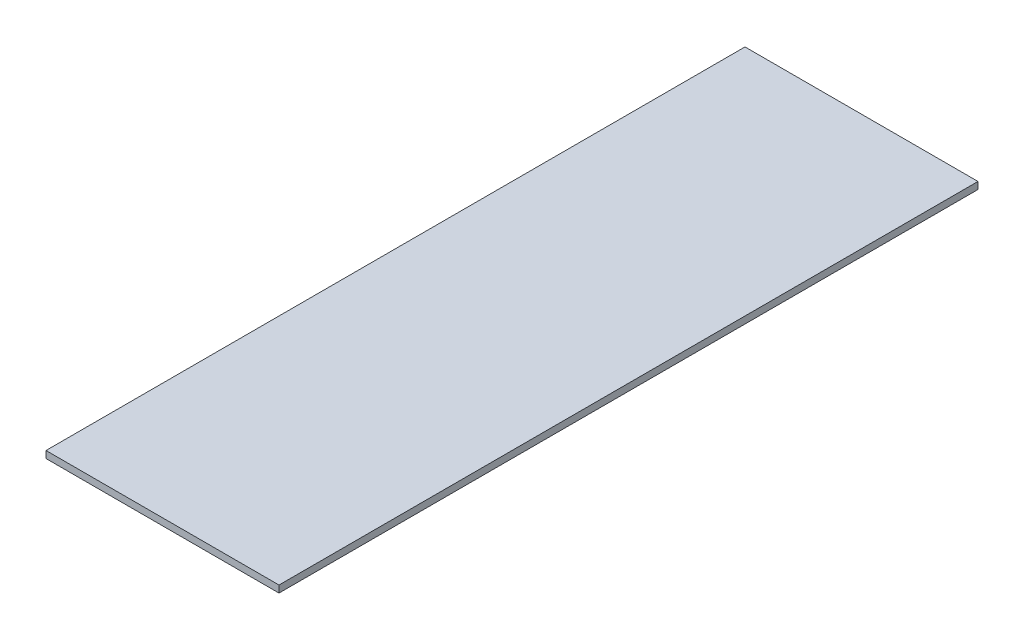
ISO-10303-21;
HEADER;
FILE_DESCRIPTION(('STEP AP214'),'2;1');
FILE_NAME('part.step','',(''),(''),'','','');
FILE_SCHEMA(('AUTOMOTIVE_DESIGN { 1 0 10303 214 1 1 1 1 }'));
ENDSEC;
DATA;
#1=APPLICATION_CONTEXT('core data for automotive mechanical design processes');
#2=APPLICATION_PROTOCOL_DEFINITION('international standard','automotive_design',2000,#1);
#3=PRODUCT_CONTEXT('',#1,'mechanical');
#4=PRODUCT('Part','Part','',(#3));
#5=PRODUCT_RELATED_PRODUCT_CATEGORY('part','',(#4));
#6=PRODUCT_DEFINITION_FORMATION('','',#4);
#7=PRODUCT_DEFINITION_CONTEXT('part definition',#1,'design');
#8=PRODUCT_DEFINITION('design','',#6,#7);
#9=PRODUCT_DEFINITION_SHAPE('','',#8);
#10=(LENGTH_UNIT() NAMED_UNIT(*) SI_UNIT(.MILLI.,.METRE.));
#11=(NAMED_UNIT(*) PLANE_ANGLE_UNIT() SI_UNIT($,.RADIAN.));
#12=(NAMED_UNIT(*) SI_UNIT($,.STERADIAN.) SOLID_ANGLE_UNIT());
#13=UNCERTAINTY_MEASURE_WITH_UNIT(LENGTH_MEASURE(1.E-05),#10,'distance_accuracy_value','');
#14=(GEOMETRIC_REPRESENTATION_CONTEXT(3) GLOBAL_UNCERTAINTY_ASSIGNED_CONTEXT((#13)) GLOBAL_UNIT_ASSIGNED_CONTEXT((#10,
#11,#12)) REPRESENTATION_CONTEXT('',''));
#15=CARTESIAN_POINT('',(0.,0.,0.));
#16=DIRECTION('',(0.,0.,1.));
#17=DIRECTION('',(1.,0.,0.));
#18=AXIS2_PLACEMENT_3D('',#15,#16,#17);
#19=CARTESIAN_POINT('',(50.,3.,150.));
#20=DIRECTION('',(-1.,0.,0.));
#21=DIRECTION('',(0.,0.,1.));
#22=AXIS2_PLACEMENT_3D('',#19,#20,#21);
#23=PLANE('',#22);
#24=DIRECTION('',(0.,0.,-1.));
#25=VECTOR('',#24,1.);
#26=CARTESIAN_POINT('',(50.,0.,150.));
#27=LINE('',#26,#25);
#28=CARTESIAN_POINT('',(50.,0.,150.));
#29=VERTEX_POINT('',#28);
#30=CARTESIAN_POINT('',(50.,0.,-150.));
#31=VERTEX_POINT('',#30);
#32=EDGE_CURVE('E97',#29,#31,#27,.T.);
#33=ORIENTED_EDGE('',*,*,#32,.T.);
#34=DIRECTION('',(0.,-1.,0.));
#35=VECTOR('',#34,1.);
#36=CARTESIAN_POINT('',(50.,3.,-150.));
#37=LINE('',#36,#35);
#38=CARTESIAN_POINT('',(50.,3.,-150.));
#39=VERTEX_POINT('',#38);
#40=EDGE_CURVE('E11',#39,#31,#37,.T.);
#41=ORIENTED_EDGE('',*,*,#40,.F.);
#42=DIRECTION('',(0.,0.,-1.));
#43=VECTOR('',#42,1.);
#44=CARTESIAN_POINT('',(50.,3.,150.));
#45=LINE('',#44,#43);
#46=CARTESIAN_POINT('',(50.,3.,150.));
#47=VERTEX_POINT('',#46);
#48=EDGE_CURVE('E85',#47,#39,#45,.T.);
#49=ORIENTED_EDGE('',*,*,#48,.F.);
#50=DIRECTION('',(0.,-1.,0.));
#51=VECTOR('',#50,1.);
#52=CARTESIAN_POINT('',(50.,3.,150.));
#53=LINE('',#52,#51);
#54=EDGE_CURVE('E93',#47,#29,#53,.T.);
#55=ORIENTED_EDGE('',*,*,#54,.T.);
#56=EDGE_LOOP('',(#33,#41,#49,#55));
#57=FACE_BOUND('',#56,.T.);
#58=ADVANCED_FACE('F34',(#57),#23,.F.);
#59=CARTESIAN_POINT('',(-50.,3.,-150.));
#60=DIRECTION('',(0.,0.,1.));
#61=DIRECTION('',(1.,0.,0.));
#62=AXIS2_PLACEMENT_3D('',#59,#60,#61);
#63=PLANE('',#62);
#64=DIRECTION('',(-1.,0.,0.));
#65=VECTOR('',#64,1.);
#66=CARTESIAN_POINT('',(-50.,0.,-150.));
#67=LINE('',#66,#65);
#68=CARTESIAN_POINT('',(-50.,0.,-150.));
#69=VERTEX_POINT('',#68);
#70=EDGE_CURVE('E89',#31,#69,#67,.T.);
#71=ORIENTED_EDGE('',*,*,#70,.T.);
#72=DIRECTION('',(0.,-1.,0.));
#73=VECTOR('',#72,1.);
#74=CARTESIAN_POINT('',(-50.,3.,-150.));
#75=LINE('',#74,#73);
#76=CARTESIAN_POINT('',(-50.,3.,-150.));
#77=VERTEX_POINT('',#76);
#78=EDGE_CURVE('E42',#77,#69,#75,.T.);
#79=ORIENTED_EDGE('',*,*,#78,.F.);
#80=DIRECTION('',(-1.,0.,0.));
#81=VECTOR('',#80,1.);
#82=CARTESIAN_POINT('',(-50.,3.,-150.));
#83=LINE('',#82,#81);
#84=EDGE_CURVE('E80',#39,#77,#83,.T.);
#85=ORIENTED_EDGE('',*,*,#84,.F.);
#86=ORIENTED_EDGE('',*,*,#40,.T.);
#87=EDGE_LOOP('',(#71,#79,#85,#86));
#88=FACE_BOUND('',#87,.T.);
#89=ADVANCED_FACE('F88',(#88),#63,.F.);
#90=CARTESIAN_POINT('',(-50.,3.,150.));
#91=DIRECTION('',(1.,0.,0.));
#92=DIRECTION('',(0.,0.,-1.));
#93=AXIS2_PLACEMENT_3D('',#90,#91,#92);
#94=PLANE('',#93);
#95=DIRECTION('',(0.,0.,1.));
#96=VECTOR('',#95,1.);
#97=CARTESIAN_POINT('',(-50.,0.,150.));
#98=LINE('',#97,#96);
#99=CARTESIAN_POINT('',(-50.,0.,150.));
#100=VERTEX_POINT('',#99);
#101=EDGE_CURVE('E67',#69,#100,#98,.T.);
#102=ORIENTED_EDGE('',*,*,#101,.T.);
#103=DIRECTION('',(0.,-1.,0.));
#104=VECTOR('',#103,1.);
#105=CARTESIAN_POINT('',(-50.,3.,150.));
#106=LINE('',#105,#104);
#107=CARTESIAN_POINT('',(-50.,3.,150.));
#108=VERTEX_POINT('',#107);
#109=EDGE_CURVE('E90',#108,#100,#106,.T.);
#110=ORIENTED_EDGE('',*,*,#109,.F.);
#111=DIRECTION('',(0.,0.,1.));
#112=VECTOR('',#111,1.);
#113=CARTESIAN_POINT('',(-50.,3.,150.));
#114=LINE('',#113,#112);
#115=EDGE_CURVE('E83',#77,#108,#114,.T.);
#116=ORIENTED_EDGE('',*,*,#115,.F.);
#117=ORIENTED_EDGE('',*,*,#78,.T.);
#118=EDGE_LOOP('',(#102,#110,#116,#117));
#119=FACE_BOUND('',#118,.T.);
#120=ADVANCED_FACE('F91',(#119),#94,.F.);
#121=CARTESIAN_POINT('',(-50.,3.,150.));
#122=DIRECTION('',(0.,0.,-1.));
#123=DIRECTION('',(-1.,0.,0.));
#124=AXIS2_PLACEMENT_3D('',#121,#122,#123);
#125=PLANE('',#124);
#126=DIRECTION('',(1.,0.,0.));
#127=VECTOR('',#126,1.);
#128=CARTESIAN_POINT('',(-50.,0.,150.));
#129=LINE('',#128,#127);
#130=EDGE_CURVE('E73',#100,#29,#129,.T.);
#131=ORIENTED_EDGE('',*,*,#130,.T.);
#132=ORIENTED_EDGE('',*,*,#54,.F.);
#133=DIRECTION('',(1.,0.,0.));
#134=VECTOR('',#133,1.);
#135=CARTESIAN_POINT('',(-50.,3.,150.));
#136=LINE('',#135,#134);
#137=EDGE_CURVE('E50',#108,#47,#136,.T.);
#138=ORIENTED_EDGE('',*,*,#137,.F.);
#139=ORIENTED_EDGE('',*,*,#109,.T.);
#140=EDGE_LOOP('',(#131,#132,#138,#139));
#141=FACE_BOUND('',#140,.T.);
#142=ADVANCED_FACE('F104',(#141),#125,.F.);
#143=CARTESIAN_POINT('',(0.,3.,0.));
#144=DIRECTION('',(0.,-1.,0.));
#145=DIRECTION('',(0.,0.,-1.));
#146=AXIS2_PLACEMENT_3D('',#143,#144,#145);
#147=PLANE('',#146);
#148=ORIENTED_EDGE('',*,*,#48,.T.);
#149=ORIENTED_EDGE('',*,*,#84,.T.);
#150=ORIENTED_EDGE('',*,*,#115,.T.);
#151=ORIENTED_EDGE('',*,*,#137,.T.);
#152=EDGE_LOOP('',(#148,#149,#150,#151));
#153=FACE_BOUND('',#152,.T.);
#154=ADVANCED_FACE('F81',(#153),#147,.F.);
#155=CARTESIAN_POINT('',(0.,0.,0.));
#156=DIRECTION('',(0.,-1.,0.));
#157=DIRECTION('',(0.,0.,-1.));
#158=AXIS2_PLACEMENT_3D('',#155,#156,#157);
#159=PLANE('',#158);
#160=ORIENTED_EDGE('',*,*,#32,.F.);
#161=ORIENTED_EDGE('',*,*,#130,.F.);
#162=ORIENTED_EDGE('',*,*,#101,.F.);
#163=ORIENTED_EDGE('',*,*,#70,.F.);
#164=EDGE_LOOP('',(#160,#161,#162,#163));
#165=FACE_BOUND('',#164,.T.);
#166=ADVANCED_FACE('F107',(#165),#159,.T.);
#167=CLOSED_SHELL('',(#58,#89,#120,#142,#154,#166));
#168=MANIFOLD_SOLID_BREP('B2',#167);
#169=ADVANCED_BREP_SHAPE_REPRESENTATION('',(#18,#168),#14);
#170=SHAPE_DEFINITION_REPRESENTATION(#9,#169);
ENDSEC;
END-ISO-10303-21;
